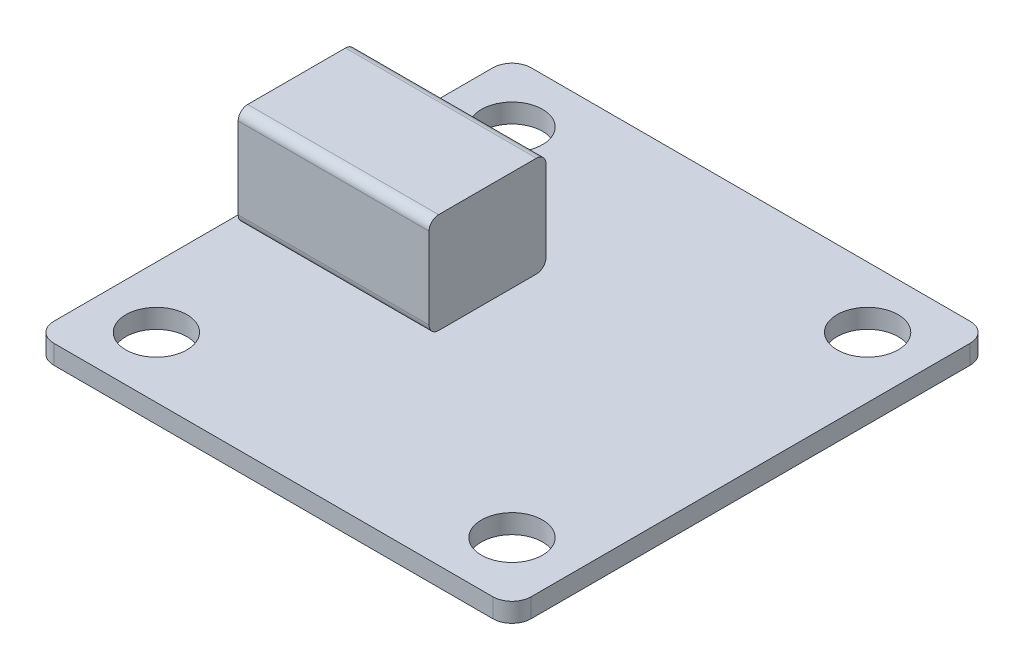
ISO-10303-21;
HEADER;
FILE_DESCRIPTION(('STEP AP214'),'2;1');
FILE_NAME('part.step','',(''),(''),'','','');
FILE_SCHEMA(('AUTOMOTIVE_DESIGN { 1 0 10303 214 1 1 1 1 }'));
ENDSEC;
DATA;
#1=APPLICATION_CONTEXT('core data for automotive mechanical design processes');
#2=APPLICATION_PROTOCOL_DEFINITION('international standard','automotive_design',2000,#1);
#3=PRODUCT_CONTEXT('',#1,'mechanical');
#4=PRODUCT('Part','Part','',(#3));
#5=PRODUCT_RELATED_PRODUCT_CATEGORY('part','',(#4));
#6=PRODUCT_DEFINITION_FORMATION('','',#4);
#7=PRODUCT_DEFINITION_CONTEXT('part definition',#1,'design');
#8=PRODUCT_DEFINITION('design','',#6,#7);
#9=PRODUCT_DEFINITION_SHAPE('','',#8);
#10=(LENGTH_UNIT() NAMED_UNIT(*) SI_UNIT(.MILLI.,.METRE.));
#11=(NAMED_UNIT(*) PLANE_ANGLE_UNIT() SI_UNIT($,.RADIAN.));
#12=(NAMED_UNIT(*) SI_UNIT($,.STERADIAN.) SOLID_ANGLE_UNIT());
#13=UNCERTAINTY_MEASURE_WITH_UNIT(LENGTH_MEASURE(1.E-05),#10,'distance_accuracy_value','');
#14=(GEOMETRIC_REPRESENTATION_CONTEXT(3) GLOBAL_UNCERTAINTY_ASSIGNED_CONTEXT((#13)) GLOBAL_UNIT_ASSIGNED_CONTEXT((#10,
#11,#12)) REPRESENTATION_CONTEXT('',''));
#15=CARTESIAN_POINT('',(0.,0.,0.));
#16=DIRECTION('',(0.,0.,1.));
#17=DIRECTION('',(1.,0.,0.));
#18=AXIS2_PLACEMENT_3D('',#15,#16,#17);
#19=CARTESIAN_POINT('',(0.,1.,0.));
#20=DIRECTION('',(0.,1.,0.));
#21=DIRECTION('',(0.,0.,1.));
#22=AXIS2_PLACEMENT_3D('',#19,#20,#21);
#23=PLANE('',#22);
#24=DIRECTION('',(0.,0.,1.));
#25=VECTOR('',#24,1.);
#26=CARTESIAN_POINT('',(-30.4231358797775,1.,11.5362253788928));
#27=LINE('',#26,#25);
#28=CARTESIAN_POINT('',(-30.4231358797775,1.,11.5362253788928));
#29=VERTEX_POINT('',#28);
#30=CARTESIAN_POINT('',(-30.4231358797775,1.,16.659931286616));
#31=VERTEX_POINT('',#30);
#32=EDGE_CURVE('E175',#29,#31,#27,.T.);
#33=ORIENTED_EDGE('',*,*,#32,.T.);
#34=DIRECTION('',(-1.,0.,0.));
#35=VECTOR('',#34,1.);
#36=CARTESIAN_POINT('',(-30.4231358797775,1.,16.659931286616));
#37=LINE('',#36,#35);
#38=CARTESIAN_POINT('',(-40.4231358797775,1.,16.659931286616));
#39=VERTEX_POINT('',#38);
#40=EDGE_CURVE('E228',#31,#39,#37,.T.);
#41=ORIENTED_EDGE('',*,*,#40,.T.);
#42=DIRECTION('',(0.,0.,1.));
#43=VECTOR('',#42,1.);
#44=CARTESIAN_POINT('',(-40.4231358797775,1.,11.5362253788928));
#45=LINE('',#44,#43);
#46=CARTESIAN_POINT('',(-40.4231358797775,1.,11.5362253788928));
#47=VERTEX_POINT('',#46);
#48=EDGE_CURVE('E165',#47,#39,#45,.T.);
#49=ORIENTED_EDGE('',*,*,#48,.F.);
#50=DIRECTION('',(-1.,0.,0.));
#51=VECTOR('',#50,1.);
#52=CARTESIAN_POINT('',(-30.4231358797775,1.,11.5362253788928));
#53=LINE('',#52,#51);
#54=EDGE_CURVE('E196',#29,#47,#53,.T.);
#55=ORIENTED_EDGE('',*,*,#54,.F.);
#56=EDGE_LOOP('',(#33,#41,#49,#55));
#57=FACE_BOUND('',#56,.T.);
#58=CARTESIAN_POINT('',(-37.736271759555,1.,5.50000000000001));
#59=DIRECTION('',(0.,1.,0.));
#60=DIRECTION('',(0.,0.,1.));
#61=AXIS2_PLACEMENT_3D('',#58,#59,#60);
#62=CIRCLE('',#61,1.6);
#63=CARTESIAN_POINT('',(-37.736271759555,1.,7.10000000000001));
#64=VERTEX_POINT('',#63);
#65=EDGE_CURVE('E238',#64,#64,#62,.T.);
#66=ORIENTED_EDGE('',*,*,#65,.F.);
#67=EDGE_LOOP('',(#66));
#68=FACE_BOUND('',#67,.T.);
#69=CARTESIAN_POINT('',(-19.11,1.,24.13));
#70=DIRECTION('',(0.,1.,0.));
#71=DIRECTION('',(0.,0.,1.));
#72=AXIS2_PLACEMENT_3D('',#69,#70,#71);
#73=CIRCLE('',#72,1.6);
#74=CARTESIAN_POINT('',(-19.11,1.,25.73));
#75=VERTEX_POINT('',#74);
#76=EDGE_CURVE('E250',#75,#75,#73,.T.);
#77=ORIENTED_EDGE('',*,*,#76,.F.);
#78=EDGE_LOOP('',(#77));
#79=FACE_BOUND('',#78,.T.);
#80=DIRECTION('',(-1.,0.,0.));
#81=VECTOR('',#80,1.);
#82=CARTESIAN_POINT('',(-40.9231358797775,1.,2.315));
#83=LINE('',#82,#81);
#84=CARTESIAN_POINT('',(-16.9231358797775,1.,2.315));
#85=VERTEX_POINT('',#84);
#86=CARTESIAN_POINT('',(-39.9231358797775,1.,2.315));
#87=VERTEX_POINT('',#86);
#88=EDGE_CURVE('E259',#85,#87,#83,.T.);
#89=ORIENTED_EDGE('',*,*,#88,.T.);
#90=CARTESIAN_POINT('',(-39.9231358797775,1.,3.315));
#91=DIRECTION('',(0.,1.,0.));
#92=DIRECTION('',(0.,0.,1.));
#93=AXIS2_PLACEMENT_3D('',#90,#91,#92);
#94=CIRCLE('',#93,1.);
#95=CARTESIAN_POINT('',(-40.9231358797775,1.,3.315));
#96=VERTEX_POINT('',#95);
#97=EDGE_CURVE('E301',#87,#96,#94,.T.);
#98=ORIENTED_EDGE('',*,*,#97,.T.);
#99=DIRECTION('',(0.,0.,1.));
#100=VECTOR('',#99,1.);
#101=CARTESIAN_POINT('',(-40.9231358797775,1.,2.315));
#102=LINE('',#101,#100);
#103=CARTESIAN_POINT('',(-40.9231358797775,1.,26.315));
#104=VERTEX_POINT('',#103);
#105=EDGE_CURVE('E263',#96,#104,#102,.T.);
#106=ORIENTED_EDGE('',*,*,#105,.T.);
#107=CARTESIAN_POINT('',(-39.9231358797775,1.,26.315));
#108=DIRECTION('',(0.,1.,0.));
#109=DIRECTION('',(0.,0.,1.));
#110=AXIS2_PLACEMENT_3D('',#107,#108,#109);
#111=CIRCLE('',#110,1.);
#112=CARTESIAN_POINT('',(-39.9231358797775,1.,27.315));
#113=VERTEX_POINT('',#112);
#114=EDGE_CURVE('E295',#104,#113,#111,.T.);
#115=ORIENTED_EDGE('',*,*,#114,.T.);
#116=DIRECTION('',(1.,0.,0.));
#117=VECTOR('',#116,1.);
#118=CARTESIAN_POINT('',(-40.9231358797775,1.,27.315));
#119=LINE('',#118,#117);
#120=CARTESIAN_POINT('',(-16.9231358797775,1.,27.315));
#121=VERTEX_POINT('',#120);
#122=EDGE_CURVE('E266',#113,#121,#119,.T.);
#123=ORIENTED_EDGE('',*,*,#122,.T.);
#124=CARTESIAN_POINT('',(-16.9231358797775,1.,26.315));
#125=DIRECTION('',(0.,1.,0.));
#126=DIRECTION('',(0.,0.,1.));
#127=AXIS2_PLACEMENT_3D('',#124,#125,#126);
#128=CIRCLE('',#127,1.);
#129=CARTESIAN_POINT('',(-15.9231358797775,1.,26.315));
#130=VERTEX_POINT('',#129);
#131=EDGE_CURVE('E297',#121,#130,#128,.T.);
#132=ORIENTED_EDGE('',*,*,#131,.T.);
#133=DIRECTION('',(0.,0.,-1.));
#134=VECTOR('',#133,1.);
#135=CARTESIAN_POINT('',(-15.9231358797775,1.,2.315));
#136=LINE('',#135,#134);
#137=CARTESIAN_POINT('',(-15.9231358797775,1.,3.315));
#138=VERTEX_POINT('',#137);
#139=EDGE_CURVE('E256',#130,#138,#136,.T.);
#140=ORIENTED_EDGE('',*,*,#139,.T.);
#141=CARTESIAN_POINT('',(-16.9231358797775,1.,3.315));
#142=DIRECTION('',(0.,1.,0.));
#143=DIRECTION('',(0.,0.,1.));
#144=AXIS2_PLACEMENT_3D('',#141,#142,#143);
#145=CIRCLE('',#144,1.);
#146=EDGE_CURVE('E299',#138,#85,#145,.T.);
#147=ORIENTED_EDGE('',*,*,#146,.T.);
#148=EDGE_LOOP('',(#89,#98,#106,#115,#123,#132,#140,#147));
#149=FACE_BOUND('',#148,.T.);
#150=CARTESIAN_POINT('',(-37.736271759555,1.,24.13));
#151=DIRECTION('',(0.,1.,0.));
#152=DIRECTION('',(0.,0.,1.));
#153=AXIS2_PLACEMENT_3D('',#150,#151,#152);
#154=CIRCLE('',#153,1.6);
#155=CARTESIAN_POINT('',(-37.736271759555,1.,25.73));
#156=VERTEX_POINT('',#155);
#157=EDGE_CURVE('E244',#156,#156,#154,.T.);
#158=ORIENTED_EDGE('',*,*,#157,.F.);
#159=EDGE_LOOP('',(#158));
#160=FACE_BOUND('',#159,.T.);
#161=CARTESIAN_POINT('',(-19.11,1.,5.5));
#162=DIRECTION('',(0.,1.,0.));
#163=DIRECTION('',(0.,0.,1.));
#164=AXIS2_PLACEMENT_3D('',#161,#162,#163);
#165=CIRCLE('',#164,1.6);
#166=CARTESIAN_POINT('',(-19.11,1.,7.1));
#167=VERTEX_POINT('',#166);
#168=EDGE_CURVE('E232',#167,#167,#165,.T.);
#169=ORIENTED_EDGE('',*,*,#168,.F.);
#170=EDGE_LOOP('',(#169));
#171=FACE_BOUND('',#170,.T.);
#172=ADVANCED_FACE('F37',(#57,#68,#79,#149,#160,#171),#23,.T.);
#173=CARTESIAN_POINT('',(0.,0.,0.));
#174=DIRECTION('',(0.,1.,0.));
#175=DIRECTION('',(0.,0.,1.));
#176=AXIS2_PLACEMENT_3D('',#173,#174,#175);
#177=PLANE('',#176);
#178=DIRECTION('',(0.,0.,1.));
#179=VECTOR('',#178,1.);
#180=CARTESIAN_POINT('',(-40.9231358797775,0.,2.315));
#181=LINE('',#180,#179);
#182=CARTESIAN_POINT('',(-40.9231358797775,0.,3.315));
#183=VERTEX_POINT('',#182);
#184=CARTESIAN_POINT('',(-40.9231358797775,0.,26.315));
#185=VERTEX_POINT('',#184);
#186=EDGE_CURVE('E274',#183,#185,#181,.T.);
#187=ORIENTED_EDGE('',*,*,#186,.F.);
#188=CARTESIAN_POINT('',(-39.9231358797775,0.,3.315));
#189=DIRECTION('',(0.,1.,0.));
#190=DIRECTION('',(0.,0.,1.));
#191=AXIS2_PLACEMENT_3D('',#188,#189,#190);
#192=CIRCLE('',#191,1.);
#193=CARTESIAN_POINT('',(-39.9231358797775,0.,2.315));
#194=VERTEX_POINT('',#193);
#195=EDGE_CURVE('E288',#183,#194,#192,.F.);
#196=ORIENTED_EDGE('',*,*,#195,.T.);
#197=DIRECTION('',(-1.,0.,0.));
#198=VECTOR('',#197,1.);
#199=CARTESIAN_POINT('',(-40.9231358797775,0.,2.315));
#200=LINE('',#199,#198);
#201=CARTESIAN_POINT('',(-16.9231358797775,0.,2.315));
#202=VERTEX_POINT('',#201);
#203=EDGE_CURVE('E271',#202,#194,#200,.T.);
#204=ORIENTED_EDGE('',*,*,#203,.F.);
#205=CARTESIAN_POINT('',(-16.9231358797775,0.,3.315));
#206=DIRECTION('',(0.,1.,0.));
#207=DIRECTION('',(0.,0.,1.));
#208=AXIS2_PLACEMENT_3D('',#205,#206,#207);
#209=CIRCLE('',#208,1.);
#210=CARTESIAN_POINT('',(-15.9231358797775,0.,3.315));
#211=VERTEX_POINT('',#210);
#212=EDGE_CURVE('E286',#202,#211,#209,.F.);
#213=ORIENTED_EDGE('',*,*,#212,.T.);
#214=DIRECTION('',(0.,0.,-1.));
#215=VECTOR('',#214,1.);
#216=CARTESIAN_POINT('',(-15.9231358797775,0.,2.315));
#217=LINE('',#216,#215);
#218=CARTESIAN_POINT('',(-15.9231358797775,0.,26.315));
#219=VERTEX_POINT('',#218);
#220=EDGE_CURVE('E253',#219,#211,#217,.T.);
#221=ORIENTED_EDGE('',*,*,#220,.F.);
#222=CARTESIAN_POINT('',(-16.9231358797775,0.,26.315));
#223=DIRECTION('',(0.,1.,0.));
#224=DIRECTION('',(0.,0.,1.));
#225=AXIS2_PLACEMENT_3D('',#222,#223,#224);
#226=CIRCLE('',#225,1.);
#227=CARTESIAN_POINT('',(-16.9231358797775,0.,27.315));
#228=VERTEX_POINT('',#227);
#229=EDGE_CURVE('E284',#219,#228,#226,.F.);
#230=ORIENTED_EDGE('',*,*,#229,.T.);
#231=DIRECTION('',(1.,0.,0.));
#232=VECTOR('',#231,1.);
#233=CARTESIAN_POINT('',(-40.9231358797775,0.,27.315));
#234=LINE('',#233,#232);
#235=CARTESIAN_POINT('',(-39.9231358797775,0.,27.315));
#236=VERTEX_POINT('',#235);
#237=EDGE_CURVE('E260',#236,#228,#234,.T.);
#238=ORIENTED_EDGE('',*,*,#237,.F.);
#239=CARTESIAN_POINT('',(-39.9231358797775,0.,26.315));
#240=DIRECTION('',(0.,1.,0.));
#241=DIRECTION('',(0.,0.,1.));
#242=AXIS2_PLACEMENT_3D('',#239,#240,#241);
#243=CIRCLE('',#242,1.);
#244=EDGE_CURVE('E282',#236,#185,#243,.F.);
#245=ORIENTED_EDGE('',*,*,#244,.T.);
#246=EDGE_LOOP('',(#187,#196,#204,#213,#221,#230,#238,#245));
#247=FACE_BOUND('',#246,.T.);
#248=CARTESIAN_POINT('',(-19.11,0.,24.13));
#249=DIRECTION('',(0.,1.,0.));
#250=DIRECTION('',(0.,0.,1.));
#251=AXIS2_PLACEMENT_3D('',#248,#249,#250);
#252=CIRCLE('',#251,1.6);
#253=CARTESIAN_POINT('',(-19.11,0.,25.73));
#254=VERTEX_POINT('',#253);
#255=EDGE_CURVE('E247',#254,#254,#252,.T.);
#256=ORIENTED_EDGE('',*,*,#255,.T.);
#257=EDGE_LOOP('',(#256));
#258=FACE_BOUND('',#257,.T.);
#259=CARTESIAN_POINT('',(-37.736271759555,0.,24.13));
#260=DIRECTION('',(0.,1.,0.));
#261=DIRECTION('',(0.,0.,1.));
#262=AXIS2_PLACEMENT_3D('',#259,#260,#261);
#263=CIRCLE('',#262,1.6);
#264=CARTESIAN_POINT('',(-37.736271759555,0.,25.73));
#265=VERTEX_POINT('',#264);
#266=EDGE_CURVE('E241',#265,#265,#263,.T.);
#267=ORIENTED_EDGE('',*,*,#266,.T.);
#268=EDGE_LOOP('',(#267));
#269=FACE_BOUND('',#268,.T.);
#270=CARTESIAN_POINT('',(-37.736271759555,0.,5.50000000000001));
#271=DIRECTION('',(0.,1.,0.));
#272=DIRECTION('',(0.,0.,1.));
#273=AXIS2_PLACEMENT_3D('',#270,#271,#272);
#274=CIRCLE('',#273,1.6);
#275=CARTESIAN_POINT('',(-37.736271759555,0.,7.10000000000001));
#276=VERTEX_POINT('',#275);
#277=EDGE_CURVE('E235',#276,#276,#274,.T.);
#278=ORIENTED_EDGE('',*,*,#277,.T.);
#279=EDGE_LOOP('',(#278));
#280=FACE_BOUND('',#279,.T.);
#281=CARTESIAN_POINT('',(-19.11,0.,5.5));
#282=DIRECTION('',(0.,1.,0.));
#283=DIRECTION('',(0.,0.,1.));
#284=AXIS2_PLACEMENT_3D('',#281,#282,#283);
#285=CIRCLE('',#284,1.6);
#286=CARTESIAN_POINT('',(-19.11,0.,7.1));
#287=VERTEX_POINT('',#286);
#288=EDGE_CURVE('E217',#287,#287,#285,.T.);
#289=ORIENTED_EDGE('',*,*,#288,.T.);
#290=EDGE_LOOP('',(#289));
#291=FACE_BOUND('',#290,.T.);
#292=ADVANCED_FACE('F315',(#247,#258,#269,#280,#291),#177,.F.);
#293=CARTESIAN_POINT('',(-15.9231358797775,1.,2.315));
#294=DIRECTION('',(-1.,0.,0.));
#295=DIRECTION('',(0.,0.,1.));
#296=AXIS2_PLACEMENT_3D('',#293,#294,#295);
#297=PLANE('',#296);
#298=ORIENTED_EDGE('',*,*,#220,.T.);
#299=DIRECTION('',(0.,-1.,0.));
#300=VECTOR('',#299,1.);
#301=CARTESIAN_POINT('',(-15.9231358797775,1.,3.315));
#302=LINE('',#301,#300);
#303=EDGE_CURVE('E306',#211,#138,#302,.F.);
#304=ORIENTED_EDGE('',*,*,#303,.T.);
#305=ORIENTED_EDGE('',*,*,#139,.F.);
#306=DIRECTION('',(0.,-1.,0.));
#307=VECTOR('',#306,1.);
#308=CARTESIAN_POINT('',(-15.9231358797775,1.,26.315));
#309=LINE('',#308,#307);
#310=EDGE_CURVE('E303',#130,#219,#309,.T.);
#311=ORIENTED_EDGE('',*,*,#310,.T.);
#312=EDGE_LOOP('',(#298,#304,#305,#311));
#313=FACE_BOUND('',#312,.T.);
#314=ADVANCED_FACE('F324',(#313),#297,.F.);
#315=CARTESIAN_POINT('',(-40.9231358797775,1.,2.315));
#316=DIRECTION('',(0.,0.,1.));
#317=DIRECTION('',(1.,0.,0.));
#318=AXIS2_PLACEMENT_3D('',#315,#316,#317);
#319=PLANE('',#318);
#320=ORIENTED_EDGE('',*,*,#203,.T.);
#321=DIRECTION('',(0.,-1.,0.));
#322=VECTOR('',#321,1.);
#323=CARTESIAN_POINT('',(-39.9231358797775,1.,2.315));
#324=LINE('',#323,#322);
#325=EDGE_CURVE('E293',#194,#87,#324,.F.);
#326=ORIENTED_EDGE('',*,*,#325,.T.);
#327=ORIENTED_EDGE('',*,*,#88,.F.);
#328=DIRECTION('',(0.,-1.,0.));
#329=VECTOR('',#328,1.);
#330=CARTESIAN_POINT('',(-16.9231358797775,1.,2.315));
#331=LINE('',#330,#329);
#332=EDGE_CURVE('E290',#85,#202,#331,.T.);
#333=ORIENTED_EDGE('',*,*,#332,.T.);
#334=EDGE_LOOP('',(#320,#326,#327,#333));
#335=FACE_BOUND('',#334,.T.);
#336=ADVANCED_FACE('F335',(#335),#319,.F.);
#337=CARTESIAN_POINT('',(-40.9231358797775,1.,2.315));
#338=DIRECTION('',(1.,0.,0.));
#339=DIRECTION('',(0.,0.,-1.));
#340=AXIS2_PLACEMENT_3D('',#337,#338,#339);
#341=PLANE('',#340);
#342=ORIENTED_EDGE('',*,*,#105,.F.);
#343=DIRECTION('',(0.,-1.,0.));
#344=VECTOR('',#343,1.);
#345=CARTESIAN_POINT('',(-40.9231358797775,1.,3.315));
#346=LINE('',#345,#344);
#347=EDGE_CURVE('E279',#96,#183,#346,.T.);
#348=ORIENTED_EDGE('',*,*,#347,.T.);
#349=ORIENTED_EDGE('',*,*,#186,.T.);
#350=DIRECTION('',(0.,-1.,0.));
#351=VECTOR('',#350,1.);
#352=CARTESIAN_POINT('',(-40.9231358797775,1.,26.315));
#353=LINE('',#352,#351);
#354=EDGE_CURVE('E268',#185,#104,#353,.F.);
#355=ORIENTED_EDGE('',*,*,#354,.T.);
#356=EDGE_LOOP('',(#342,#348,#349,#355));
#357=FACE_BOUND('',#356,.T.);
#358=ADVANCED_FACE('F343',(#357),#341,.F.);
#359=CARTESIAN_POINT('',(-40.9231358797775,1.,27.315));
#360=DIRECTION('',(0.,0.,-1.));
#361=DIRECTION('',(-1.,0.,0.));
#362=AXIS2_PLACEMENT_3D('',#359,#360,#361);
#363=PLANE('',#362);
#364=ORIENTED_EDGE('',*,*,#237,.T.);
#365=DIRECTION('',(0.,-1.,0.));
#366=VECTOR('',#365,1.);
#367=CARTESIAN_POINT('',(-16.9231358797775,1.,27.315));
#368=LINE('',#367,#366);
#369=EDGE_CURVE('E11',#228,#121,#368,.F.);
#370=ORIENTED_EDGE('',*,*,#369,.T.);
#371=ORIENTED_EDGE('',*,*,#122,.F.);
#372=DIRECTION('',(0.,-1.,0.));
#373=VECTOR('',#372,1.);
#374=CARTESIAN_POINT('',(-39.9231358797775,1.,27.315));
#375=LINE('',#374,#373);
#376=EDGE_CURVE('E45',#113,#236,#375,.T.);
#377=ORIENTED_EDGE('',*,*,#376,.T.);
#378=EDGE_LOOP('',(#364,#370,#371,#377));
#379=FACE_BOUND('',#378,.T.);
#380=ADVANCED_FACE('F310',(#379),#363,.F.);
#381=CARTESIAN_POINT('',(-19.11,1.,24.13));
#382=DIRECTION('',(0.,-1.,0.));
#383=DIRECTION('',(0.,0.,-1.));
#384=AXIS2_PLACEMENT_3D('',#381,#382,#383);
#385=CYLINDRICAL_SURFACE('',#384,1.6);
#386=ORIENTED_EDGE('',*,*,#76,.T.);
#387=EDGE_LOOP('',(#386));
#388=FACE_BOUND('',#387,.T.);
#389=ORIENTED_EDGE('',*,*,#255,.F.);
#390=EDGE_LOOP('',(#389));
#391=FACE_BOUND('',#390,.T.);
#392=ADVANCED_FACE('F363',(#388,#391),#385,.F.);
#393=CARTESIAN_POINT('',(-37.736271759555,1.,24.13));
#394=DIRECTION('',(0.,-1.,0.));
#395=DIRECTION('',(0.,0.,-1.));
#396=AXIS2_PLACEMENT_3D('',#393,#394,#395);
#397=CYLINDRICAL_SURFACE('',#396,1.6);
#398=ORIENTED_EDGE('',*,*,#157,.T.);
#399=EDGE_LOOP('',(#398));
#400=FACE_BOUND('',#399,.T.);
#401=ORIENTED_EDGE('',*,*,#266,.F.);
#402=EDGE_LOOP('',(#401));
#403=FACE_BOUND('',#402,.T.);
#404=ADVANCED_FACE('F560',(#400,#403),#397,.F.);
#405=CARTESIAN_POINT('',(-37.736271759555,1.,5.50000000000001));
#406=DIRECTION('',(0.,-1.,0.));
#407=DIRECTION('',(0.,0.,-1.));
#408=AXIS2_PLACEMENT_3D('',#405,#406,#407);
#409=CYLINDRICAL_SURFACE('',#408,1.6);
#410=ORIENTED_EDGE('',*,*,#65,.T.);
#411=EDGE_LOOP('',(#410));
#412=FACE_BOUND('',#411,.T.);
#413=ORIENTED_EDGE('',*,*,#277,.F.);
#414=EDGE_LOOP('',(#413));
#415=FACE_BOUND('',#414,.T.);
#416=ADVANCED_FACE('F550',(#412,#415),#409,.F.);
#417=CARTESIAN_POINT('',(-19.11,1.,5.5));
#418=DIRECTION('',(0.,-1.,0.));
#419=DIRECTION('',(0.,0.,-1.));
#420=AXIS2_PLACEMENT_3D('',#417,#418,#419);
#421=CYLINDRICAL_SURFACE('',#420,1.6);
#422=ORIENTED_EDGE('',*,*,#168,.T.);
#423=EDGE_LOOP('',(#422));
#424=FACE_BOUND('',#423,.T.);
#425=ORIENTED_EDGE('',*,*,#288,.F.);
#426=EDGE_LOOP('',(#425));
#427=FACE_BOUND('',#426,.T.);
#428=ADVANCED_FACE('F376',(#424,#427),#421,.F.);
#429=CARTESIAN_POINT('',(-39.9231358797775,1.,3.315));
#430=DIRECTION('',(0.,-1.,0.));
#431=DIRECTION('',(0.,0.,-1.));
#432=AXIS2_PLACEMENT_3D('',#429,#430,#431);
#433=CYLINDRICAL_SURFACE('',#432,1.);
#434=ORIENTED_EDGE('',*,*,#97,.F.);
#435=ORIENTED_EDGE('',*,*,#325,.F.);
#436=ORIENTED_EDGE('',*,*,#195,.F.);
#437=ORIENTED_EDGE('',*,*,#347,.F.);
#438=EDGE_LOOP('',(#434,#435,#436,#437));
#439=FACE_BOUND('',#438,.T.);
#440=ADVANCED_FACE('F340',(#439),#433,.T.);
#441=CARTESIAN_POINT('',(-16.9231358797775,1.,3.315));
#442=DIRECTION('',(0.,-1.,0.));
#443=DIRECTION('',(0.,0.,-1.));
#444=AXIS2_PLACEMENT_3D('',#441,#442,#443);
#445=CYLINDRICAL_SURFACE('',#444,1.);
#446=ORIENTED_EDGE('',*,*,#146,.F.);
#447=ORIENTED_EDGE('',*,*,#303,.F.);
#448=ORIENTED_EDGE('',*,*,#212,.F.);
#449=ORIENTED_EDGE('',*,*,#332,.F.);
#450=EDGE_LOOP('',(#446,#447,#448,#449));
#451=FACE_BOUND('',#450,.T.);
#452=ADVANCED_FACE('F332',(#451),#445,.T.);
#453=CARTESIAN_POINT('',(-16.9231358797775,1.,26.315));
#454=DIRECTION('',(0.,-1.,0.));
#455=DIRECTION('',(0.,0.,-1.));
#456=AXIS2_PLACEMENT_3D('',#453,#454,#455);
#457=CYLINDRICAL_SURFACE('',#456,1.);
#458=ORIENTED_EDGE('',*,*,#131,.F.);
#459=ORIENTED_EDGE('',*,*,#369,.F.);
#460=ORIENTED_EDGE('',*,*,#229,.F.);
#461=ORIENTED_EDGE('',*,*,#310,.F.);
#462=EDGE_LOOP('',(#458,#459,#460,#461));
#463=FACE_BOUND('',#462,.T.);
#464=ADVANCED_FACE('F321',(#463),#457,.T.);
#465=CARTESIAN_POINT('',(-39.9231358797775,1.,26.315));
#466=DIRECTION('',(0.,-1.,0.));
#467=DIRECTION('',(0.,0.,-1.));
#468=AXIS2_PLACEMENT_3D('',#465,#466,#467);
#469=CYLINDRICAL_SURFACE('',#468,1.);
#470=ORIENTED_EDGE('',*,*,#114,.F.);
#471=ORIENTED_EDGE('',*,*,#354,.F.);
#472=ORIENTED_EDGE('',*,*,#244,.F.);
#473=ORIENTED_EDGE('',*,*,#376,.F.);
#474=EDGE_LOOP('',(#470,#471,#472,#473));
#475=FACE_BOUND('',#474,.T.);
#476=ADVANCED_FACE('F39',(#475),#469,.T.);
#477=CARTESIAN_POINT('',(-30.4231358797775,1.5,11.5362253788928));
#478=DIRECTION('',(-1.,0.,0.));
#479=DIRECTION('',(0.,0.,1.));
#480=AXIS2_PLACEMENT_3D('',#477,#478,#479);
#481=CYLINDRICAL_SURFACE('',#480,0.5);
#482=CARTESIAN_POINT('',(-40.4231358797775,1.5,11.5362253788928));
#483=DIRECTION('',(-1.,0.,0.));
#484=DIRECTION('',(0.,0.,-1.));
#485=AXIS2_PLACEMENT_3D('',#482,#483,#484);
#486=CIRCLE('',#485,0.5);
#487=CARTESIAN_POINT('',(-40.4231358797775,1.5,11.0362253788928));
#488=VERTEX_POINT('',#487);
#489=EDGE_CURVE('E52',#488,#47,#486,.T.);
#490=ORIENTED_EDGE('',*,*,#489,.F.);
#491=DIRECTION('',(-1.,0.,0.));
#492=VECTOR('',#491,1.);
#493=CARTESIAN_POINT('',(-30.4231358797775,1.5,11.0362253788928));
#494=LINE('',#493,#492);
#495=CARTESIAN_POINT('',(-30.4231358797775,1.5,11.0362253788928));
#496=VERTEX_POINT('',#495);
#497=EDGE_CURVE('E215',#496,#488,#494,.T.);
#498=ORIENTED_EDGE('',*,*,#497,.F.);
#499=CARTESIAN_POINT('',(-30.4231358797775,1.5,11.5362253788928));
#500=DIRECTION('',(-1.,0.,0.));
#501=DIRECTION('',(0.,0.,-1.));
#502=AXIS2_PLACEMENT_3D('',#499,#500,#501);
#503=CIRCLE('',#502,0.5);
#504=EDGE_CURVE('E172',#496,#29,#503,.T.);
#505=ORIENTED_EDGE('',*,*,#504,.T.);
#506=ORIENTED_EDGE('',*,*,#54,.T.);
#507=EDGE_LOOP('',(#490,#498,#505,#506));
#508=FACE_BOUND('',#507,.T.);
#509=ADVANCED_FACE('F346',(#508),#481,.T.);
#510=CARTESIAN_POINT('',(-30.4231358797775,1.5,11.0362253788928));
#511=DIRECTION('',(0.,0.,-1.));
#512=DIRECTION('',(-1.,0.,0.));
#513=AXIS2_PLACEMENT_3D('',#510,#511,#512);
#514=PLANE('',#513);
#515=DIRECTION('',(0.,-1.,0.));
#516=VECTOR('',#515,1.);
#517=CARTESIAN_POINT('',(-40.4231358797775,1.5,11.0362253788928));
#518=LINE('',#517,#516);
#519=CARTESIAN_POINT('',(-40.4231358797775,5.75777714006664,11.0362253788928));
#520=VERTEX_POINT('',#519);
#521=EDGE_CURVE('E176',#520,#488,#518,.T.);
#522=ORIENTED_EDGE('',*,*,#521,.F.);
#523=DIRECTION('',(-1.,0.,0.));
#524=VECTOR('',#523,1.);
#525=CARTESIAN_POINT('',(-30.4231358797775,5.75777714006664,11.0362253788928));
#526=LINE('',#525,#524);
#527=CARTESIAN_POINT('',(-30.4231358797775,5.75777714006664,11.0362253788928));
#528=VERTEX_POINT('',#527);
#529=EDGE_CURVE('E218',#528,#520,#526,.T.);
#530=ORIENTED_EDGE('',*,*,#529,.F.);
#531=DIRECTION('',(0.,-1.,0.));
#532=VECTOR('',#531,1.);
#533=CARTESIAN_POINT('',(-30.4231358797775,1.5,11.0362253788928));
#534=LINE('',#533,#532);
#535=EDGE_CURVE('E194',#528,#496,#534,.T.);
#536=ORIENTED_EDGE('',*,*,#535,.T.);
#537=ORIENTED_EDGE('',*,*,#497,.T.);
#538=EDGE_LOOP('',(#522,#530,#536,#537));
#539=FACE_BOUND('',#538,.T.);
#540=ADVANCED_FACE('F351',(#539),#514,.T.);
#541=CARTESIAN_POINT('',(-30.4231358797775,5.75777714006665,11.5362253788928));
#542=DIRECTION('',(-1.,0.,0.));
#543=DIRECTION('',(0.,0.,1.));
#544=AXIS2_PLACEMENT_3D('',#541,#542,#543);
#545=CYLINDRICAL_SURFACE('',#544,0.5);
#546=CARTESIAN_POINT('',(-40.4231358797775,5.75777714006665,11.5362253788928));
#547=DIRECTION('',(-1.,0.,0.));
#548=DIRECTION('',(0.,0.,1.));
#549=AXIS2_PLACEMENT_3D('',#546,#547,#548);
#550=CIRCLE('',#549,0.5);
#551=CARTESIAN_POINT('',(-40.4231358797775,6.25777714006665,11.5362253788928));
#552=VERTEX_POINT('',#551);
#553=EDGE_CURVE('E211',#552,#520,#550,.T.);
#554=ORIENTED_EDGE('',*,*,#553,.F.);
#555=DIRECTION('',(-1.,0.,0.));
#556=VECTOR('',#555,1.);
#557=CARTESIAN_POINT('',(-30.4231358797775,6.25777714006665,11.5362253788928));
#558=LINE('',#557,#556);
#559=CARTESIAN_POINT('',(-30.4231358797775,6.25777714006665,11.5362253788928));
#560=VERTEX_POINT('',#559);
#561=EDGE_CURVE('E220',#560,#552,#558,.T.);
#562=ORIENTED_EDGE('',*,*,#561,.F.);
#563=CARTESIAN_POINT('',(-30.4231358797775,5.75777714006665,11.5362253788928));
#564=DIRECTION('',(-1.,0.,0.));
#565=DIRECTION('',(0.,0.,1.));
#566=AXIS2_PLACEMENT_3D('',#563,#564,#565);
#567=CIRCLE('',#566,0.5);
#568=EDGE_CURVE('E191',#560,#528,#567,.T.);
#569=ORIENTED_EDGE('',*,*,#568,.T.);
#570=ORIENTED_EDGE('',*,*,#529,.T.);
#571=EDGE_LOOP('',(#554,#562,#569,#570));
#572=FACE_BOUND('',#571,.T.);
#573=ADVANCED_FACE('F415',(#572),#545,.T.);
#574=CARTESIAN_POINT('',(-30.4231358797775,6.25777714006665,11.5362253788928));
#575=DIRECTION('',(0.,1.,0.));
#576=DIRECTION('',(0.,0.,1.));
#577=AXIS2_PLACEMENT_3D('',#574,#575,#576);
#578=PLANE('',#577);
#579=DIRECTION('',(0.,0.,-1.));
#580=VECTOR('',#579,1.);
#581=CARTESIAN_POINT('',(-40.4231358797775,6.25777714006665,11.5362253788928));
#582=LINE('',#581,#580);
#583=CARTESIAN_POINT('',(-40.4231358797775,6.25777714006665,16.659931286616));
#584=VERTEX_POINT('',#583);
#585=EDGE_CURVE('E208',#584,#552,#582,.T.);
#586=ORIENTED_EDGE('',*,*,#585,.F.);
#587=DIRECTION('',(-1.,0.,0.));
#588=VECTOR('',#587,1.);
#589=CARTESIAN_POINT('',(-30.4231358797775,6.25777714006665,16.659931286616));
#590=LINE('',#589,#588);
#591=CARTESIAN_POINT('',(-30.4231358797775,6.25777714006665,16.659931286616));
#592=VERTEX_POINT('',#591);
#593=EDGE_CURVE('E222',#592,#584,#590,.T.);
#594=ORIENTED_EDGE('',*,*,#593,.F.);
#595=DIRECTION('',(0.,0.,-1.));
#596=VECTOR('',#595,1.);
#597=CARTESIAN_POINT('',(-30.4231358797775,6.25777714006665,11.5362253788928));
#598=LINE('',#597,#596);
#599=EDGE_CURVE('E188',#592,#560,#598,.T.);
#600=ORIENTED_EDGE('',*,*,#599,.T.);
#601=ORIENTED_EDGE('',*,*,#561,.T.);
#602=EDGE_LOOP('',(#586,#594,#600,#601));
#603=FACE_BOUND('',#602,.T.);
#604=ADVANCED_FACE('F426',(#603),#578,.T.);
#605=CARTESIAN_POINT('',(-30.4231358797775,5.75777714006665,16.659931286616));
#606=DIRECTION('',(-1.,0.,0.));
#607=DIRECTION('',(0.,0.,1.));
#608=AXIS2_PLACEMENT_3D('',#605,#606,#607);
#609=CYLINDRICAL_SURFACE('',#608,0.5);
#610=CARTESIAN_POINT('',(-40.4231358797775,5.75777714006665,16.659931286616));
#611=DIRECTION('',(-1.,0.,0.));
#612=DIRECTION('',(0.,0.,-1.));
#613=AXIS2_PLACEMENT_3D('',#610,#611,#612);
#614=CIRCLE('',#613,0.5);
#615=CARTESIAN_POINT('',(-40.4231358797775,5.75777714006664,17.159931286616));
#616=VERTEX_POINT('',#615);
#617=EDGE_CURVE('E205',#616,#584,#614,.T.);
#618=ORIENTED_EDGE('',*,*,#617,.F.);
#619=DIRECTION('',(-1.,0.,0.));
#620=VECTOR('',#619,1.);
#621=CARTESIAN_POINT('',(-30.4231358797775,5.75777714006664,17.159931286616));
#622=LINE('',#621,#620);
#623=CARTESIAN_POINT('',(-30.4231358797775,5.75777714006664,17.159931286616));
#624=VERTEX_POINT('',#623);
#625=EDGE_CURVE('E224',#624,#616,#622,.T.);
#626=ORIENTED_EDGE('',*,*,#625,.F.);
#627=CARTESIAN_POINT('',(-30.4231358797775,5.75777714006665,16.659931286616));
#628=DIRECTION('',(-1.,0.,0.));
#629=DIRECTION('',(0.,0.,-1.));
#630=AXIS2_PLACEMENT_3D('',#627,#628,#629);
#631=CIRCLE('',#630,0.5);
#632=EDGE_CURVE('E185',#624,#592,#631,.T.);
#633=ORIENTED_EDGE('',*,*,#632,.T.);
#634=ORIENTED_EDGE('',*,*,#593,.T.);
#635=EDGE_LOOP('',(#618,#626,#633,#634));
#636=FACE_BOUND('',#635,.T.);
#637=ADVANCED_FACE('F437',(#636),#609,.T.);
#638=CARTESIAN_POINT('',(-30.4231358797775,1.5,17.159931286616));
#639=DIRECTION('',(0.,0.,1.));
#640=DIRECTION('',(1.,0.,0.));
#641=AXIS2_PLACEMENT_3D('',#638,#639,#640);
#642=PLANE('',#641);
#643=DIRECTION('',(0.,1.,0.));
#644=VECTOR('',#643,1.);
#645=CARTESIAN_POINT('',(-40.4231358797775,1.5,17.159931286616));
#646=LINE('',#645,#644);
#647=CARTESIAN_POINT('',(-40.4231358797775,1.5,17.159931286616));
#648=VERTEX_POINT('',#647);
#649=EDGE_CURVE('E202',#648,#616,#646,.T.);
#650=ORIENTED_EDGE('',*,*,#649,.F.);
#651=DIRECTION('',(-1.,0.,0.));
#652=VECTOR('',#651,1.);
#653=CARTESIAN_POINT('',(-30.4231358797775,1.5,17.159931286616));
#654=LINE('',#653,#652);
#655=CARTESIAN_POINT('',(-30.4231358797775,1.5,17.159931286616));
#656=VERTEX_POINT('',#655);
#657=EDGE_CURVE('E226',#656,#648,#654,.T.);
#658=ORIENTED_EDGE('',*,*,#657,.F.);
#659=DIRECTION('',(0.,1.,0.));
#660=VECTOR('',#659,1.);
#661=CARTESIAN_POINT('',(-30.4231358797775,1.5,17.159931286616));
#662=LINE('',#661,#660);
#663=EDGE_CURVE('E182',#656,#624,#662,.T.);
#664=ORIENTED_EDGE('',*,*,#663,.T.);
#665=ORIENTED_EDGE('',*,*,#625,.T.);
#666=EDGE_LOOP('',(#650,#658,#664,#665));
#667=FACE_BOUND('',#666,.T.);
#668=ADVANCED_FACE('F448',(#667),#642,.T.);
#669=CARTESIAN_POINT('',(-30.4231358797775,1.5,16.659931286616));
#670=DIRECTION('',(-1.,0.,0.));
#671=DIRECTION('',(0.,0.,1.));
#672=AXIS2_PLACEMENT_3D('',#669,#670,#671);
#673=CYLINDRICAL_SURFACE('',#672,0.5);
#674=CARTESIAN_POINT('',(-40.4231358797775,1.5,16.659931286616));
#675=DIRECTION('',(-1.,0.,0.));
#676=DIRECTION('',(0.,0.,1.));
#677=AXIS2_PLACEMENT_3D('',#674,#675,#676);
#678=CIRCLE('',#677,0.5);
#679=EDGE_CURVE('E199',#39,#648,#678,.T.);
#680=ORIENTED_EDGE('',*,*,#679,.F.);
#681=ORIENTED_EDGE('',*,*,#40,.F.);
#682=CARTESIAN_POINT('',(-30.4231358797775,1.5,16.659931286616));
#683=DIRECTION('',(-1.,0.,0.));
#684=DIRECTION('',(0.,0.,1.));
#685=AXIS2_PLACEMENT_3D('',#682,#683,#684);
#686=CIRCLE('',#685,0.5);
#687=EDGE_CURVE('E179',#31,#656,#686,.T.);
#688=ORIENTED_EDGE('',*,*,#687,.T.);
#689=ORIENTED_EDGE('',*,*,#657,.T.);
#690=EDGE_LOOP('',(#680,#681,#688,#689));
#691=FACE_BOUND('',#690,.T.);
#692=ADVANCED_FACE('F459',(#691),#673,.T.);
#693=CARTESIAN_POINT('',(-30.4231358797775,1.5,11.5362253788928));
#694=DIRECTION('',(1.,0.,0.));
#695=DIRECTION('',(0.,0.,-1.));
#696=AXIS2_PLACEMENT_3D('',#693,#694,#695);
#697=PLANE('',#696);
#698=ORIENTED_EDGE('',*,*,#504,.F.);
#699=ORIENTED_EDGE('',*,*,#535,.F.);
#700=ORIENTED_EDGE('',*,*,#568,.F.);
#701=ORIENTED_EDGE('',*,*,#599,.F.);
#702=ORIENTED_EDGE('',*,*,#632,.F.);
#703=ORIENTED_EDGE('',*,*,#663,.F.);
#704=ORIENTED_EDGE('',*,*,#687,.F.);
#705=ORIENTED_EDGE('',*,*,#32,.F.);
#706=EDGE_LOOP('',(#698,#699,#700,#701,#702,#703,#704,#705));
#707=FACE_BOUND('',#706,.T.);
#708=ADVANCED_FACE('F470',(#707),#697,.T.);
#709=CARTESIAN_POINT('',(-40.4231358797775,1.5,11.5362253788928));
#710=DIRECTION('',(1.,0.,0.));
#711=DIRECTION('',(0.,0.,-1.));
#712=AXIS2_PLACEMENT_3D('',#709,#710,#711);
#713=PLANE('',#712);
#714=CARTESIAN_POINT('',(-40.4231358797775,3.59936841416336,14.0831424646868));
#715=DIRECTION('',(-1.,0.,0.));
#716=DIRECTION('',(0.,0.,1.));
#717=AXIS2_PLACEMENT_3D('',#714,#715,#716);
#718=CIRCLE('',#717,1.775);
#719=CARTESIAN_POINT('',(-40.4231358797775,3.59936841416336,15.8581424646868));
#720=VERTEX_POINT('',#719);
#721=EDGE_CURVE('E168',#720,#720,#718,.T.);
#722=ORIENTED_EDGE('',*,*,#721,.F.);
#723=EDGE_LOOP('',(#722));
#724=FACE_BOUND('',#723,.T.);
#725=ORIENTED_EDGE('',*,*,#489,.T.);
#726=ORIENTED_EDGE('',*,*,#48,.T.);
#727=ORIENTED_EDGE('',*,*,#679,.T.);
#728=ORIENTED_EDGE('',*,*,#649,.T.);
#729=ORIENTED_EDGE('',*,*,#617,.T.);
#730=ORIENTED_EDGE('',*,*,#585,.T.);
#731=ORIENTED_EDGE('',*,*,#553,.T.);
#732=ORIENTED_EDGE('',*,*,#521,.T.);
#733=EDGE_LOOP('',(#725,#726,#727,#728,#729,#730,#731,#732));
#734=FACE_BOUND('',#733,.T.);
#735=ADVANCED_FACE('F157',(#724,#734),#713,.F.);
#736=CARTESIAN_POINT('',(-34.4231358797775,3.59936841416336,14.0831424646867));
#737=DIRECTION('',(-1.,0.,0.));
#738=DIRECTION('',(0.,0.,1.));
#739=AXIS2_PLACEMENT_3D('',#736,#737,#738);
#740=CONICAL_SURFACE('',#739,1.74999999999999,1.02974425867665);
#741=CARTESIAN_POINT('',(-33.3716297964793,3.59936841416336,14.0831424646867));
#742=VERTEX_POINT('',#741);
#743=VERTEX_LOOP('',#742);
#744=FACE_BOUND('',#743,.T.);
#745=CARTESIAN_POINT('',(-34.4231358797775,3.59936841416336,14.0831424646867));
#746=DIRECTION('',(-1.,0.,0.));
#747=DIRECTION('',(0.,0.,1.));
#748=AXIS2_PLACEMENT_3D('',#745,#746,#747);
#749=CIRCLE('',#748,1.74999999999999);
#750=CARTESIAN_POINT('',(-34.4231358797775,3.59936841416336,15.8331424646867));
#751=VERTEX_POINT('',#750);
#752=EDGE_CURVE('E161',#751,#751,#749,.T.);
#753=ORIENTED_EDGE('',*,*,#752,.T.);
#754=EDGE_LOOP('',(#753));
#755=FACE_BOUND('',#754,.T.);
#756=ADVANCED_FACE('F153',(#744,#755),#740,.F.);
#757=CARTESIAN_POINT('',(-40.4231358797775,3.59936841416336,14.0831424646868));
#758=DIRECTION('',(-1.,0.,0.));
#759=DIRECTION('',(0.,0.,1.));
#760=AXIS2_PLACEMENT_3D('',#757,#758,#759);
#761=CYLINDRICAL_SURFACE('',#760,1.74999999999999);
#762=ORIENTED_EDGE('',*,*,#752,.F.);
#763=EDGE_LOOP('',(#762));
#764=FACE_BOUND('',#763,.T.);
#765=CARTESIAN_POINT('',(-40.3981358797775,3.59936841416336,14.0831424646868));
#766=DIRECTION('',(-1.,0.,0.));
#767=DIRECTION('',(0.,0.,1.));
#768=AXIS2_PLACEMENT_3D('',#765,#766,#767);
#769=CIRCLE('',#768,1.75);
#770=CARTESIAN_POINT('',(-40.3981358797775,3.59936841416336,15.8331424646867));
#771=VERTEX_POINT('',#770);
#772=EDGE_CURVE('E163',#771,#771,#769,.T.);
#773=ORIENTED_EDGE('',*,*,#772,.T.);
#774=EDGE_LOOP('',(#773));
#775=FACE_BOUND('',#774,.T.);
#776=ADVANCED_FACE('F156',(#764,#775),#761,.F.);
#777=CARTESIAN_POINT('',(-40.4231358797775,3.59936841416336,14.0831424646868));
#778=DIRECTION('',(-1.,0.,0.));
#779=DIRECTION('',(0.,0.,1.));
#780=AXIS2_PLACEMENT_3D('',#777,#778,#779);
#781=CONICAL_SURFACE('',#780,1.775,0.785398163397518);
#782=ORIENTED_EDGE('',*,*,#772,.F.);
#783=EDGE_LOOP('',(#782));
#784=FACE_BOUND('',#783,.T.);
#785=ORIENTED_EDGE('',*,*,#721,.T.);
#786=EDGE_LOOP('',(#785));
#787=FACE_BOUND('',#786,.T.);
#788=ADVANCED_FACE('F508',(#784,#787),#781,.F.);
#789=CLOSED_SHELL('',(#172,#292,#314,#336,#358,#380,#392,#404,#416,#428,#440,#452,#464,#476,
#509,#540,#573,#604,#637,#668,#692,#708,#735,#756,#776,#788));
#790=MANIFOLD_SOLID_BREP('B2',#789);
#791=ADVANCED_BREP_SHAPE_REPRESENTATION('',(#18,#790),#14);
#792=SHAPE_DEFINITION_REPRESENTATION(#9,#791);
ENDSEC;
END-ISO-10303-21;
